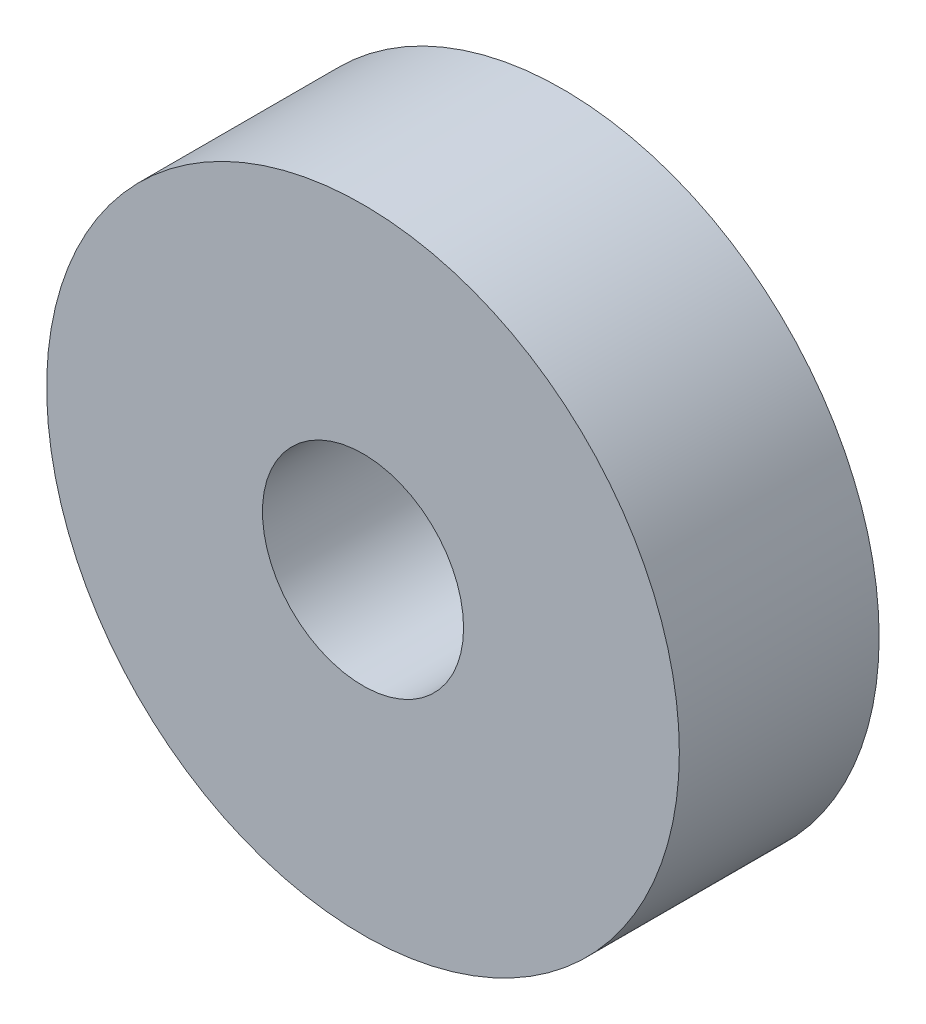
ISO-10303-21;
HEADER;
FILE_DESCRIPTION(('STEP AP214'),'2;1');
FILE_NAME('part.step','',(''),(''),'','','');
FILE_SCHEMA(('AUTOMOTIVE_DESIGN { 1 0 10303 214 1 1 1 1 }'));
ENDSEC;
DATA;
#1=APPLICATION_CONTEXT('core data for automotive mechanical design processes');
#2=APPLICATION_PROTOCOL_DEFINITION('international standard','automotive_design',2000,#1);
#3=PRODUCT_CONTEXT('',#1,'mechanical');
#4=PRODUCT('Part','Part','',(#3));
#5=PRODUCT_RELATED_PRODUCT_CATEGORY('part','',(#4));
#6=PRODUCT_DEFINITION_FORMATION('','',#4);
#7=PRODUCT_DEFINITION_CONTEXT('part definition',#1,'design');
#8=PRODUCT_DEFINITION('design','',#6,#7);
#9=PRODUCT_DEFINITION_SHAPE('','',#8);
#10=(LENGTH_UNIT() NAMED_UNIT(*) SI_UNIT(.MILLI.,.METRE.));
#11=(NAMED_UNIT(*) PLANE_ANGLE_UNIT() SI_UNIT($,.RADIAN.));
#12=(NAMED_UNIT(*) SI_UNIT($,.STERADIAN.) SOLID_ANGLE_UNIT());
#13=UNCERTAINTY_MEASURE_WITH_UNIT(LENGTH_MEASURE(1.E-05),#10,'distance_accuracy_value','');
#14=(GEOMETRIC_REPRESENTATION_CONTEXT(3) GLOBAL_UNCERTAINTY_ASSIGNED_CONTEXT((#13)) GLOBAL_UNIT_ASSIGNED_CONTEXT((#10,
#11,#12)) REPRESENTATION_CONTEXT('',''));
#15=CARTESIAN_POINT('',(0.,0.,0.));
#16=DIRECTION('',(0.,0.,1.));
#17=DIRECTION('',(1.,0.,0.));
#18=AXIS2_PLACEMENT_3D('',#15,#16,#17);
#19=CARTESIAN_POINT('',(0.,0.,-1.));
#20=DIRECTION('',(0.,0.,1.));
#21=DIRECTION('',(1.,0.,0.));
#22=AXIS2_PLACEMENT_3D('',#19,#20,#21);
#23=CYLINDRICAL_SURFACE('',#22,3.02);
#24=CARTESIAN_POINT('',(0.,0.,6.));
#25=DIRECTION('',(0.,0.,1.));
#26=DIRECTION('',(1.,0.,0.));
#27=AXIS2_PLACEMENT_3D('',#24,#25,#26);
#28=CIRCLE('',#27,3.02);
#29=CARTESIAN_POINT('',(3.02,0.,6.));
#30=VERTEX_POINT('',#29);
#31=EDGE_CURVE('E17',#30,#30,#28,.T.);
#32=ORIENTED_EDGE('',*,*,#31,.T.);
#33=EDGE_LOOP('',(#32));
#34=FACE_BOUND('',#33,.T.);
#35=CARTESIAN_POINT('',(0.,0.,0.));
#36=DIRECTION('',(0.,0.,1.));
#37=DIRECTION('',(1.,0.,0.));
#38=AXIS2_PLACEMENT_3D('',#35,#36,#37);
#39=CIRCLE('',#38,3.02);
#40=CARTESIAN_POINT('',(3.02,0.,0.));
#41=VERTEX_POINT('',#40);
#42=EDGE_CURVE('E9',#41,#41,#39,.T.);
#43=ORIENTED_EDGE('',*,*,#42,.F.);
#44=EDGE_LOOP('',(#43));
#45=FACE_BOUND('',#44,.T.);
#46=ADVANCED_FACE('F14',(#34,#45),#23,.F.);
#47=CARTESIAN_POINT('',(0.,0.,0.));
#48=DIRECTION('',(0.,0.,1.));
#49=DIRECTION('',(1.,0.,0.));
#50=AXIS2_PLACEMENT_3D('',#47,#48,#49);
#51=PLANE('',#50);
#52=ORIENTED_EDGE('',*,*,#42,.T.);
#53=EDGE_LOOP('',(#52));
#54=FACE_BOUND('',#53,.T.);
#55=CARTESIAN_POINT('',(0.,0.,0.));
#56=DIRECTION('',(0.,0.,1.));
#57=DIRECTION('',(1.,0.,0.));
#58=AXIS2_PLACEMENT_3D('',#55,#56,#57);
#59=CIRCLE('',#58,9.5);
#60=CARTESIAN_POINT('',(9.5,0.,0.));
#61=VERTEX_POINT('',#60);
#62=EDGE_CURVE('E31',#61,#61,#59,.T.);
#63=ORIENTED_EDGE('',*,*,#62,.F.);
#64=EDGE_LOOP('',(#63));
#65=FACE_BOUND('',#64,.T.);
#66=ADVANCED_FACE('F51',(#54,#65),#51,.F.);
#67=CARTESIAN_POINT('',(0.,0.,6.));
#68=DIRECTION('',(0.,0.,1.));
#69=DIRECTION('',(1.,0.,0.));
#70=AXIS2_PLACEMENT_3D('',#67,#68,#69);
#71=PLANE('',#70);
#72=ORIENTED_EDGE('',*,*,#31,.F.);
#73=EDGE_LOOP('',(#72));
#74=FACE_BOUND('',#73,.T.);
#75=CARTESIAN_POINT('',(0.,0.,6.));
#76=DIRECTION('',(0.,0.,1.));
#77=DIRECTION('',(1.,0.,0.));
#78=AXIS2_PLACEMENT_3D('',#75,#76,#77);
#79=CIRCLE('',#78,9.5);
#80=CARTESIAN_POINT('',(9.5,0.,6.));
#81=VERTEX_POINT('',#80);
#82=EDGE_CURVE('E33',#81,#81,#79,.T.);
#83=ORIENTED_EDGE('',*,*,#82,.T.);
#84=EDGE_LOOP('',(#83));
#85=FACE_BOUND('',#84,.T.);
#86=ADVANCED_FACE('F42',(#74,#85),#71,.T.);
#87=CARTESIAN_POINT('',(0.,0.,0.));
#88=DIRECTION('',(0.,0.,1.));
#89=DIRECTION('',(1.,0.,0.));
#90=AXIS2_PLACEMENT_3D('',#87,#88,#89);
#91=CYLINDRICAL_SURFACE('',#90,9.5);
#92=ORIENTED_EDGE('',*,*,#82,.F.);
#93=EDGE_LOOP('',(#92));
#94=FACE_BOUND('',#93,.T.);
#95=ORIENTED_EDGE('',*,*,#62,.T.);
#96=EDGE_LOOP('',(#95));
#97=FACE_BOUND('',#96,.T.);
#98=ADVANCED_FACE('F44',(#94,#97),#91,.T.);
#99=CLOSED_SHELL('',(#46,#66,#86,#98));
#100=MANIFOLD_SOLID_BREP('B1',#99);
#101=ADVANCED_BREP_SHAPE_REPRESENTATION('',(#18,#100),#14);
#102=SHAPE_DEFINITION_REPRESENTATION(#9,#101);
ENDSEC;
END-ISO-10303-21;
